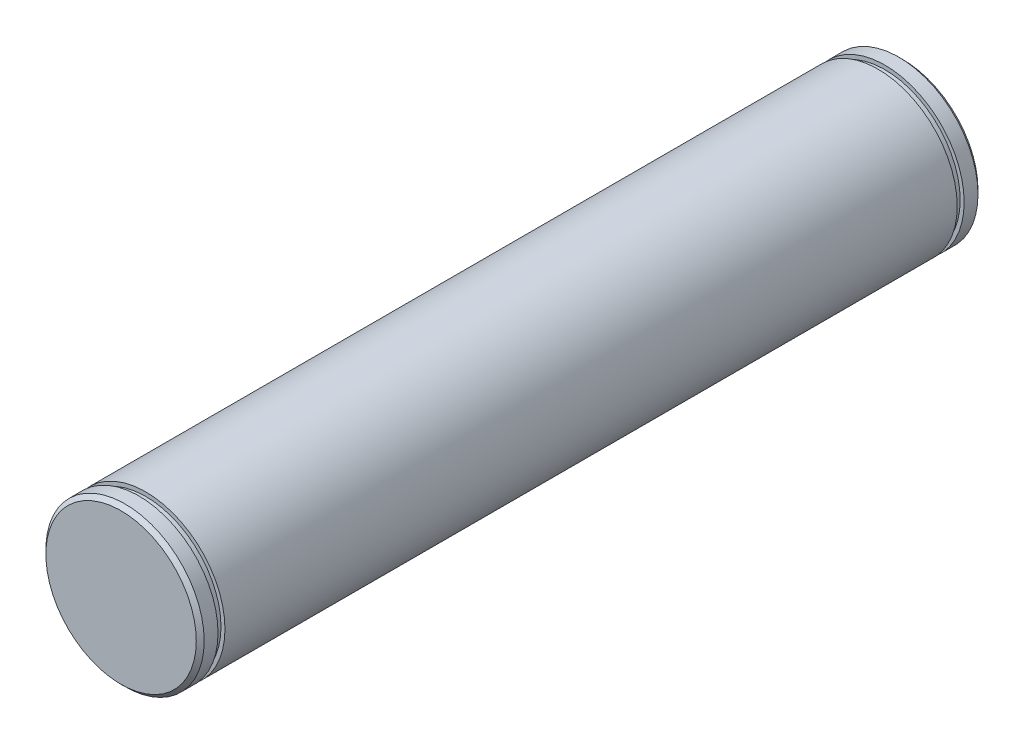
ISO-10303-21;
HEADER;
FILE_DESCRIPTION(('STEP AP214'),'2;1');
FILE_NAME('part.step','',(''),(''),'','','');
FILE_SCHEMA(('AUTOMOTIVE_DESIGN { 1 0 10303 214 1 1 1 1 }'));
ENDSEC;
DATA;
#1=APPLICATION_CONTEXT('core data for automotive mechanical design processes');
#2=APPLICATION_PROTOCOL_DEFINITION('international standard','automotive_design',2000,#1);
#3=PRODUCT_CONTEXT('',#1,'mechanical');
#4=PRODUCT('Part','Part','',(#3));
#5=PRODUCT_RELATED_PRODUCT_CATEGORY('part','',(#4));
#6=PRODUCT_DEFINITION_FORMATION('','',#4);
#7=PRODUCT_DEFINITION_CONTEXT('part definition',#1,'design');
#8=PRODUCT_DEFINITION('design','',#6,#7);
#9=PRODUCT_DEFINITION_SHAPE('','',#8);
#10=(LENGTH_UNIT() NAMED_UNIT(*) SI_UNIT(.MILLI.,.METRE.));
#11=(NAMED_UNIT(*) PLANE_ANGLE_UNIT() SI_UNIT($,.RADIAN.));
#12=(NAMED_UNIT(*) SI_UNIT($,.STERADIAN.) SOLID_ANGLE_UNIT());
#13=UNCERTAINTY_MEASURE_WITH_UNIT(LENGTH_MEASURE(1.E-05),#10,'distance_accuracy_value','');
#14=(GEOMETRIC_REPRESENTATION_CONTEXT(3) GLOBAL_UNCERTAINTY_ASSIGNED_CONTEXT((#13)) GLOBAL_UNIT_ASSIGNED_CONTEXT((#10,
#11,#12)) REPRESENTATION_CONTEXT('',''));
#15=CARTESIAN_POINT('',(0.,0.,0.));
#16=DIRECTION('',(0.,0.,1.));
#17=DIRECTION('',(1.,0.,0.));
#18=AXIS2_PLACEMENT_3D('',#15,#16,#17);
#19=CARTESIAN_POINT('',(0.,0.,19.75));
#20=DIRECTION('',(0.,0.,-1.));
#21=DIRECTION('',(-1.,0.,0.));
#22=AXIS2_PLACEMENT_3D('',#19,#20,#21);
#23=CYLINDRICAL_SURFACE('',#22,4.);
#24=CARTESIAN_POINT('',(0.,0.,18.5));
#25=DIRECTION('',(0.,0.,1.));
#26=DIRECTION('',(1.,0.,0.));
#27=AXIS2_PLACEMENT_3D('',#24,#25,#26);
#28=CIRCLE('',#27,4.);
#29=CARTESIAN_POINT('',(4.,0.,18.5));
#30=VERTEX_POINT('',#29);
#31=EDGE_CURVE('E57',#30,#30,#28,.T.);
#32=ORIENTED_EDGE('',*,*,#31,.F.);
#33=EDGE_LOOP('',(#32));
#34=FACE_BOUND('',#33,.T.);
#35=CARTESIAN_POINT('',(0.,0.,-18.5));
#36=DIRECTION('',(0.,0.,1.));
#37=DIRECTION('',(1.,0.,0.));
#38=AXIS2_PLACEMENT_3D('',#35,#36,#37);
#39=CIRCLE('',#38,4.);
#40=CARTESIAN_POINT('',(4.,0.,-18.5));
#41=VERTEX_POINT('',#40);
#42=EDGE_CURVE('E72',#41,#41,#39,.T.);
#43=ORIENTED_EDGE('',*,*,#42,.T.);
#44=EDGE_LOOP('',(#43));
#45=FACE_BOUND('',#44,.T.);
#46=ADVANCED_FACE('F31',(#34,#45),#23,.T.);
#47=CARTESIAN_POINT('',(0.,0.,19.55));
#48=DIRECTION('',(0.,0.,1.));
#49=DIRECTION('',(1.,0.,0.));
#50=AXIS2_PLACEMENT_3D('',#47,#48,#49);
#51=CIRCLE('',#50,4.);
#52=CARTESIAN_POINT('',(4.,0.,19.55));
#53=VERTEX_POINT('',#52);
#54=EDGE_CURVE('E10',#53,#53,#51,.F.);
#55=ORIENTED_EDGE('',*,*,#54,.T.);
#56=EDGE_LOOP('',(#55));
#57=FACE_BOUND('',#56,.T.);
#58=CARTESIAN_POINT('',(0.,0.,18.85));
#59=DIRECTION('',(0.,0.,1.));
#60=DIRECTION('',(1.,0.,0.));
#61=AXIS2_PLACEMENT_3D('',#58,#59,#60);
#62=CIRCLE('',#61,4.);
#63=CARTESIAN_POINT('',(4.,0.,18.85));
#64=VERTEX_POINT('',#63);
#65=EDGE_CURVE('E60',#64,#64,#62,.T.);
#66=ORIENTED_EDGE('',*,*,#65,.T.);
#67=EDGE_LOOP('',(#66));
#68=FACE_BOUND('',#67,.T.);
#69=ADVANCED_FACE('F94',(#57,#68),#23,.T.);
#70=CARTESIAN_POINT('',(0.,0.,19.75));
#71=DIRECTION('',(0.,0.,1.));
#72=DIRECTION('',(1.,0.,0.));
#73=AXIS2_PLACEMENT_3D('',#70,#71,#72);
#74=PLANE('',#73);
#75=CARTESIAN_POINT('',(0.,0.,19.75));
#76=DIRECTION('',(0.,0.,1.));
#77=DIRECTION('',(1.,0.,0.));
#78=AXIS2_PLACEMENT_3D('',#75,#76,#77);
#79=CIRCLE('',#78,3.80000000000001);
#80=CARTESIAN_POINT('',(3.80000000000001,0.,19.75));
#81=VERTEX_POINT('',#80);
#82=EDGE_CURVE('E38',#81,#81,#79,.T.);
#83=ORIENTED_EDGE('',*,*,#82,.T.);
#84=EDGE_LOOP('',(#83));
#85=FACE_BOUND('',#84,.T.);
#86=ADVANCED_FACE('F101',(#85),#74,.T.);
#87=CARTESIAN_POINT('',(0.,4.,18.85));
#88=DIRECTION('',(0.,0.,-1.));
#89=DIRECTION('',(-1.,0.,0.));
#90=AXIS2_PLACEMENT_3D('',#87,#88,#89);
#91=PLANE('',#90);
#92=CARTESIAN_POINT('',(0.,0.,18.85));
#93=DIRECTION('',(0.,0.,1.));
#94=DIRECTION('',(1.,0.,0.));
#95=AXIS2_PLACEMENT_3D('',#92,#93,#94);
#96=CIRCLE('',#95,3.8);
#97=CARTESIAN_POINT('',(3.8,0.,18.85));
#98=VERTEX_POINT('',#97);
#99=EDGE_CURVE('E51',#98,#98,#96,.T.);
#100=ORIENTED_EDGE('',*,*,#99,.T.);
#101=EDGE_LOOP('',(#100));
#102=FACE_BOUND('',#101,.T.);
#103=ORIENTED_EDGE('',*,*,#65,.F.);
#104=EDGE_LOOP('',(#103));
#105=FACE_BOUND('',#104,.T.);
#106=ADVANCED_FACE('F183',(#102,#105),#91,.T.);
#107=CARTESIAN_POINT('',(0.,0.,19.75));
#108=DIRECTION('',(0.,0.,1.));
#109=DIRECTION('',(1.,0.,0.));
#110=AXIS2_PLACEMENT_3D('',#107,#108,#109);
#111=CYLINDRICAL_SURFACE('',#110,3.8);
#112=CARTESIAN_POINT('',(0.,0.,18.5));
#113=DIRECTION('',(0.,0.,1.));
#114=DIRECTION('',(1.,0.,0.));
#115=AXIS2_PLACEMENT_3D('',#112,#113,#114);
#116=CIRCLE('',#115,3.8);
#117=CARTESIAN_POINT('',(3.8,0.,18.5));
#118=VERTEX_POINT('',#117);
#119=EDGE_CURVE('E54',#118,#118,#116,.T.);
#120=ORIENTED_EDGE('',*,*,#119,.T.);
#121=EDGE_LOOP('',(#120));
#122=FACE_BOUND('',#121,.T.);
#123=ORIENTED_EDGE('',*,*,#99,.F.);
#124=EDGE_LOOP('',(#123));
#125=FACE_BOUND('',#124,.T.);
#126=ADVANCED_FACE('F90',(#122,#125),#111,.T.);
#127=CARTESIAN_POINT('',(0.,4.,18.5));
#128=DIRECTION('',(0.,0.,1.));
#129=DIRECTION('',(1.,0.,0.));
#130=AXIS2_PLACEMENT_3D('',#127,#128,#129);
#131=PLANE('',#130);
#132=ORIENTED_EDGE('',*,*,#31,.T.);
#133=EDGE_LOOP('',(#132));
#134=FACE_BOUND('',#133,.T.);
#135=ORIENTED_EDGE('',*,*,#119,.F.);
#136=EDGE_LOOP('',(#135));
#137=FACE_BOUND('',#136,.T.);
#138=ADVANCED_FACE('F80',(#134,#137),#131,.T.);
#139=CARTESIAN_POINT('',(0.,4.,-18.5));
#140=DIRECTION('',(0.,0.,-1.));
#141=DIRECTION('',(-1.,0.,0.));
#142=AXIS2_PLACEMENT_3D('',#139,#140,#141);
#143=PLANE('',#142);
#144=CARTESIAN_POINT('',(0.,0.,-18.5));
#145=DIRECTION('',(0.,0.,1.));
#146=DIRECTION('',(1.,0.,0.));
#147=AXIS2_PLACEMENT_3D('',#144,#145,#146);
#148=CIRCLE('',#147,3.8);
#149=CARTESIAN_POINT('',(3.8,0.,-18.5));
#150=VERTEX_POINT('',#149);
#151=EDGE_CURVE('E63',#150,#150,#148,.T.);
#152=ORIENTED_EDGE('',*,*,#151,.T.);
#153=EDGE_LOOP('',(#152));
#154=FACE_BOUND('',#153,.T.);
#155=ORIENTED_EDGE('',*,*,#42,.F.);
#156=EDGE_LOOP('',(#155));
#157=FACE_BOUND('',#156,.T.);
#158=ADVANCED_FACE('F77',(#154,#157),#143,.T.);
#159=CARTESIAN_POINT('',(0.,0.,19.75));
#160=DIRECTION('',(0.,0.,1.));
#161=DIRECTION('',(1.,0.,0.));
#162=AXIS2_PLACEMENT_3D('',#159,#160,#161);
#163=CYLINDRICAL_SURFACE('',#162,3.8);
#164=CARTESIAN_POINT('',(0.,0.,-18.85));
#165=DIRECTION('',(0.,0.,1.));
#166=DIRECTION('',(1.,0.,0.));
#167=AXIS2_PLACEMENT_3D('',#164,#165,#166);
#168=CIRCLE('',#167,3.8);
#169=CARTESIAN_POINT('',(3.8,0.,-18.85));
#170=VERTEX_POINT('',#169);
#171=EDGE_CURVE('E66',#170,#170,#168,.T.);
#172=ORIENTED_EDGE('',*,*,#171,.T.);
#173=EDGE_LOOP('',(#172));
#174=FACE_BOUND('',#173,.T.);
#175=ORIENTED_EDGE('',*,*,#151,.F.);
#176=EDGE_LOOP('',(#175));
#177=FACE_BOUND('',#176,.T.);
#178=ADVANCED_FACE('F79',(#174,#177),#163,.T.);
#179=CARTESIAN_POINT('',(0.,4.,-18.85));
#180=DIRECTION('',(0.,0.,1.));
#181=DIRECTION('',(1.,0.,0.));
#182=AXIS2_PLACEMENT_3D('',#179,#180,#181);
#183=PLANE('',#182);
#184=CARTESIAN_POINT('',(0.,0.,-18.85));
#185=DIRECTION('',(0.,0.,1.));
#186=DIRECTION('',(1.,0.,0.));
#187=AXIS2_PLACEMENT_3D('',#184,#185,#186);
#188=CIRCLE('',#187,4.);
#189=CARTESIAN_POINT('',(4.,0.,-18.85));
#190=VERTEX_POINT('',#189);
#191=EDGE_CURVE('E69',#190,#190,#188,.T.);
#192=ORIENTED_EDGE('',*,*,#191,.T.);
#193=EDGE_LOOP('',(#192));
#194=FACE_BOUND('',#193,.T.);
#195=ORIENTED_EDGE('',*,*,#171,.F.);
#196=EDGE_LOOP('',(#195));
#197=FACE_BOUND('',#196,.T.);
#198=ADVANCED_FACE('F87',(#194,#197),#183,.T.);
#199=CARTESIAN_POINT('',(0.,0.,-19.75));
#200=DIRECTION('',(0.,0.,1.));
#201=DIRECTION('',(1.,0.,0.));
#202=AXIS2_PLACEMENT_3D('',#199,#200,#201);
#203=PLANE('',#202);
#204=CARTESIAN_POINT('',(0.,0.,-19.75));
#205=DIRECTION('',(0.,0.,1.));
#206=DIRECTION('',(1.,0.,0.));
#207=AXIS2_PLACEMENT_3D('',#204,#205,#206);
#208=CIRCLE('',#207,3.80000000000001);
#209=CARTESIAN_POINT('',(3.80000000000001,0.,-19.75));
#210=VERTEX_POINT('',#209);
#211=EDGE_CURVE('E42',#210,#210,#208,.F.);
#212=ORIENTED_EDGE('',*,*,#211,.T.);
#213=EDGE_LOOP('',(#212));
#214=FACE_BOUND('',#213,.T.);
#215=ADVANCED_FACE('F106',(#214),#203,.F.);
#216=CARTESIAN_POINT('',(0.,0.,-19.55));
#217=DIRECTION('',(0.,0.,1.));
#218=DIRECTION('',(1.,0.,0.));
#219=AXIS2_PLACEMENT_3D('',#216,#217,#218);
#220=CIRCLE('',#219,4.);
#221=CARTESIAN_POINT('',(4.,0.,-19.55));
#222=VERTEX_POINT('',#221);
#223=EDGE_CURVE('E46',#222,#222,#220,.T.);
#224=ORIENTED_EDGE('',*,*,#223,.T.);
#225=EDGE_LOOP('',(#224));
#226=FACE_BOUND('',#225,.T.);
#227=ORIENTED_EDGE('',*,*,#191,.F.);
#228=EDGE_LOOP('',(#227));
#229=FACE_BOUND('',#228,.T.);
#230=ADVANCED_FACE('F97',(#226,#229),#23,.T.);
#231=CARTESIAN_POINT('',(0.,0.,-19.55));
#232=DIRECTION('',(0.,0.,1.));
#233=DIRECTION('',(1.,0.,0.));
#234=AXIS2_PLACEMENT_3D('',#231,#232,#233);
#235=CONICAL_SURFACE('',#234,4.,0.785398163397457);
#236=ORIENTED_EDGE('',*,*,#211,.F.);
#237=EDGE_LOOP('',(#236));
#238=FACE_BOUND('',#237,.T.);
#239=ORIENTED_EDGE('',*,*,#223,.F.);
#240=EDGE_LOOP('',(#239));
#241=FACE_BOUND('',#240,.T.);
#242=ADVANCED_FACE('F105',(#238,#241),#235,.T.);
#243=CARTESIAN_POINT('',(0.,0.,19.75));
#244=DIRECTION('',(0.,0.,-1.));
#245=DIRECTION('',(-1.,0.,0.));
#246=AXIS2_PLACEMENT_3D('',#243,#244,#245);
#247=CONICAL_SURFACE('',#246,3.80000000000001,0.78539816339744);
#248=ORIENTED_EDGE('',*,*,#54,.F.);
#249=EDGE_LOOP('',(#248));
#250=FACE_BOUND('',#249,.T.);
#251=ORIENTED_EDGE('',*,*,#82,.F.);
#252=EDGE_LOOP('',(#251));
#253=FACE_BOUND('',#252,.T.);
#254=ADVANCED_FACE('F33',(#250,#253),#247,.T.);
#255=CLOSED_SHELL('',(#46,#69,#86,#106,#126,#138,#158,#178,#198,#215,#230,#242,#254));
#256=MANIFOLD_SOLID_BREP('B2',#255);
#257=ADVANCED_BREP_SHAPE_REPRESENTATION('',(#18,#256),#14);
#258=SHAPE_DEFINITION_REPRESENTATION(#9,#257);
ENDSEC;
END-ISO-10303-21;
